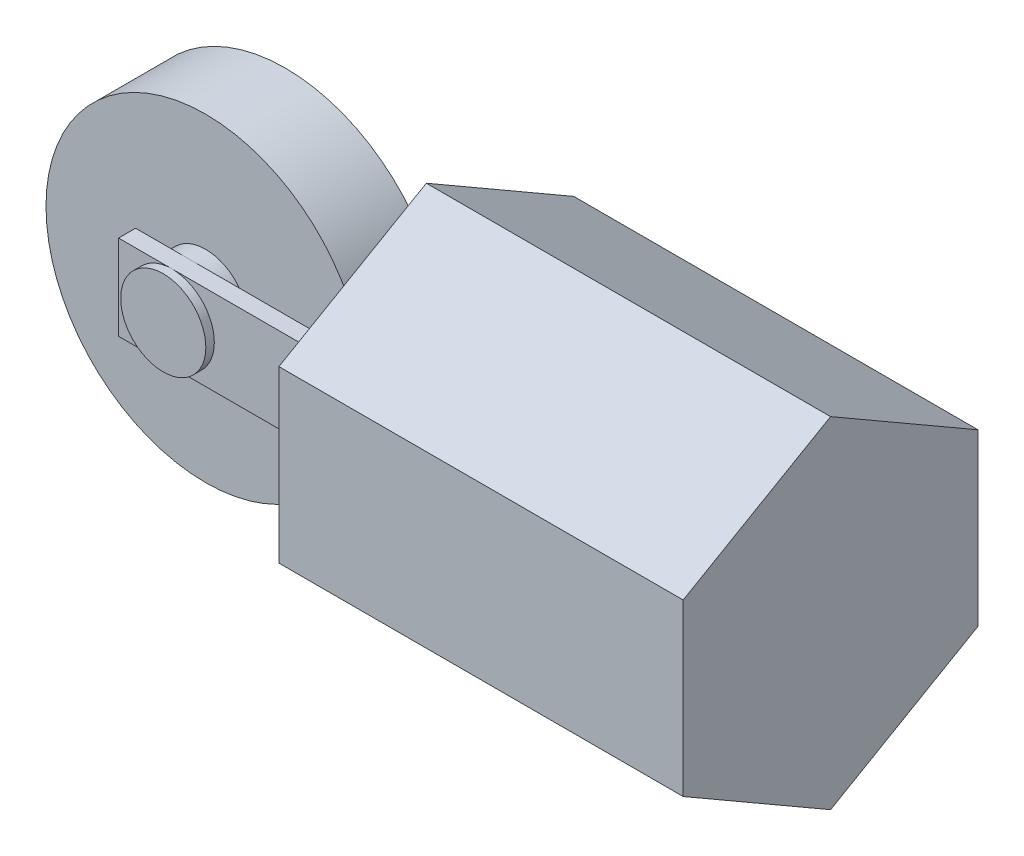
ISO-10303-21;
HEADER;
FILE_DESCRIPTION(('STEP AP214'),'2;1');
FILE_NAME('part.step','',(''),(''),'','','');
FILE_SCHEMA(('AUTOMOTIVE_DESIGN { 1 0 10303 214 1 1 1 1 }'));
ENDSEC;
DATA;
#1=APPLICATION_CONTEXT('core data for automotive mechanical design processes');
#2=APPLICATION_PROTOCOL_DEFINITION('international standard','automotive_design',2000,#1);
#3=PRODUCT_CONTEXT('',#1,'mechanical');
#4=PRODUCT('Part','Part','',(#3));
#5=PRODUCT_RELATED_PRODUCT_CATEGORY('part','',(#4));
#6=PRODUCT_DEFINITION_FORMATION('','',#4);
#7=PRODUCT_DEFINITION_CONTEXT('part definition',#1,'design');
#8=PRODUCT_DEFINITION('design','',#6,#7);
#9=PRODUCT_DEFINITION_SHAPE('','',#8);
#10=(LENGTH_UNIT() NAMED_UNIT(*) SI_UNIT(.MILLI.,.METRE.));
#11=(NAMED_UNIT(*) PLANE_ANGLE_UNIT() SI_UNIT($,.RADIAN.));
#12=(NAMED_UNIT(*) SI_UNIT($,.STERADIAN.) SOLID_ANGLE_UNIT());
#13=UNCERTAINTY_MEASURE_WITH_UNIT(LENGTH_MEASURE(1.E-05),#10,'distance_accuracy_value','');
#14=(GEOMETRIC_REPRESENTATION_CONTEXT(3) GLOBAL_UNCERTAINTY_ASSIGNED_CONTEXT((#13)) GLOBAL_UNIT_ASSIGNED_CONTEXT((#10,
#11,#12)) REPRESENTATION_CONTEXT('',''));
#15=CARTESIAN_POINT('',(0.,0.,0.));
#16=DIRECTION('',(0.,0.,1.));
#17=DIRECTION('',(1.,0.,0.));
#18=AXIS2_PLACEMENT_3D('',#15,#16,#17);
#19=CARTESIAN_POINT('',(34.925,-2.53999999999996,-4.39940905122497));
#20=DIRECTION('',(0.,0.,1.));
#21=DIRECTION('',(0.,-1.,0.));
#22=AXIS2_PLACEMENT_3D('',#19,#20,#21);
#23=PLANE('',#22);
#24=DIRECTION('',(0.,1.,0.));
#25=VECTOR('',#24,1.);
#26=CARTESIAN_POINT('',(10.795,-2.53999999999996,-4.39940905122497));
#27=LINE('',#26,#25);
#28=CARTESIAN_POINT('',(10.795,-2.53999999999996,-4.39940905122497));
#29=VERTEX_POINT('',#28);
#30=CARTESIAN_POINT('',(10.795,2.54000000000004,-4.39940905122493));
#31=VERTEX_POINT('',#30);
#32=EDGE_CURVE('E2204',#29,#31,#27,.T.);
#33=ORIENTED_EDGE('',*,*,#32,.F.);
#34=DIRECTION('',(1.,0.,0.));
#35=VECTOR('',#34,1.);
#36=CARTESIAN_POINT('',(-3.175,-2.53999999999996,-4.39940905122497));
#37=LINE('',#36,#35);
#38=CARTESIAN_POINT('',(0.,-2.53999999999996,-4.39940905122497));
#39=VERTEX_POINT('',#38);
#40=EDGE_CURVE('E2270',#39,#29,#37,.T.);
#41=ORIENTED_EDGE('',*,*,#40,.F.);
#42=CARTESIAN_POINT('',(0.,0.,-4.39940905122495));
#43=DIRECTION('',(0.,0.,1.));
#44=DIRECTION('',(0.,-1.,0.));
#45=AXIS2_PLACEMENT_3D('',#42,#43,#44);
#46=CIRCLE('',#45,2.53999999999996);
#47=CARTESIAN_POINT('',(0.,2.54000000000004,-4.39940905122493));
#48=VERTEX_POINT('',#47);
#49=EDGE_CURVE('E1997',#48,#39,#46,.F.);
#50=ORIENTED_EDGE('',*,*,#49,.F.);
#51=DIRECTION('',(1.,0.,0.));
#52=VECTOR('',#51,1.);
#53=CARTESIAN_POINT('',(-3.175,2.54000000000004,-4.39940905122493));
#54=LINE('',#53,#52);
#55=EDGE_CURVE('E2233',#48,#31,#54,.T.);
#56=ORIENTED_EDGE('',*,*,#55,.T.);
#57=EDGE_LOOP('',(#33,#41,#50,#56));
#58=FACE_BOUND('',#57,.T.);
#59=ADVANCED_FACE('F1994',(#58),#23,.F.);
#60=CARTESIAN_POINT('',(34.925,2.53999999999996,4.39940905122497));
#61=DIRECTION('',(0.,0.,-1.));
#62=DIRECTION('',(0.,1.,0.));
#63=AXIS2_PLACEMENT_3D('',#60,#61,#62);
#64=PLANE('',#63);
#65=DIRECTION('',(0.,-1.,0.));
#66=VECTOR('',#65,1.);
#67=CARTESIAN_POINT('',(10.795,2.53999999999996,4.39940905122497));
#68=LINE('',#67,#66);
#69=CARTESIAN_POINT('',(10.795,2.53999999999996,4.39940905122497));
#70=VERTEX_POINT('',#69);
#71=CARTESIAN_POINT('',(10.795,-2.54000000000004,4.39940905122493));
#72=VERTEX_POINT('',#71);
#73=EDGE_CURVE('E2188',#70,#72,#68,.T.);
#74=ORIENTED_EDGE('',*,*,#73,.F.);
#75=DIRECTION('',(1.,0.,0.));
#76=VECTOR('',#75,1.);
#77=CARTESIAN_POINT('',(-3.175,2.53999999999996,4.39940905122497));
#78=LINE('',#77,#76);
#79=CARTESIAN_POINT('',(0.,2.53999999999996,4.39940905122497));
#80=VERTEX_POINT('',#79);
#81=EDGE_CURVE('E2246',#80,#70,#78,.T.);
#82=ORIENTED_EDGE('',*,*,#81,.F.);
#83=CARTESIAN_POINT('',(0.,0.,4.39940905122495));
#84=DIRECTION('',(0.,0.,-1.));
#85=DIRECTION('',(0.,1.,0.));
#86=AXIS2_PLACEMENT_3D('',#83,#84,#85);
#87=CIRCLE('',#86,2.53999999999996);
#88=CARTESIAN_POINT('',(0.,-2.54000000000004,4.39940905122493));
#89=VERTEX_POINT('',#88);
#90=EDGE_CURVE('E2319',#89,#80,#87,.F.);
#91=ORIENTED_EDGE('',*,*,#90,.F.);
#92=DIRECTION('',(1.,0.,0.));
#93=VECTOR('',#92,1.);
#94=CARTESIAN_POINT('',(-3.175,-2.54000000000004,4.39940905122493));
#95=LINE('',#94,#93);
#96=EDGE_CURVE('E2249',#89,#72,#95,.T.);
#97=ORIENTED_EDGE('',*,*,#96,.T.);
#98=EDGE_LOOP('',(#74,#82,#91,#97));
#99=FACE_BOUND('',#98,.T.);
#100=ADVANCED_FACE('F2520',(#99),#64,.F.);
#101=CARTESIAN_POINT('',(0.,0.,-4.99859094877504));
#102=DIRECTION('',(0.,0.,1.));
#103=DIRECTION('',(1.,0.,0.));
#104=AXIS2_PLACEMENT_3D('',#101,#102,#103);
#105=CYLINDRICAL_SURFACE('',#104,2.53999999999996);
#106=CARTESIAN_POINT('',(0.,0.,-2.38125));
#107=DIRECTION('',(0.,0.,1.));
#108=DIRECTION('',(1.,0.,0.));
#109=AXIS2_PLACEMENT_3D('',#106,#107,#108);
#110=CIRCLE('',#109,2.53999999999996);
#111=CARTESIAN_POINT('',(2.53999999999996,0.,-2.38125));
#112=VERTEX_POINT('',#111);
#113=EDGE_CURVE('E2297',#112,#112,#110,.T.);
#114=ORIENTED_EDGE('',*,*,#113,.F.);
#115=EDGE_LOOP('',(#114));
#116=FACE_BOUND('',#115,.T.);
#117=CARTESIAN_POINT('',(0.,0.,-3.38340905122497));
#118=DIRECTION('',(0.,0.,-1.));
#119=DIRECTION('',(-1.,0.,0.));
#120=AXIS2_PLACEMENT_3D('',#117,#118,#119);
#121=CIRCLE('',#120,2.53999999999996);
#122=CARTESIAN_POINT('',(0.,2.54000000000004,-3.38340905122497));
#123=VERTEX_POINT('',#122);
#124=CARTESIAN_POINT('',(0.,-2.53999999999996,-3.38340905122497));
#125=VERTEX_POINT('',#124);
#126=EDGE_CURVE('E2325',#123,#125,#121,.F.);
#127=ORIENTED_EDGE('',*,*,#126,.T.);
#128=EDGE_CURVE('E2330',#125,#123,#121,.F.);
#129=ORIENTED_EDGE('',*,*,#128,.T.);
#130=EDGE_LOOP('',(#127,#129));
#131=FACE_BOUND('',#130,.T.);
#132=ADVANCED_FACE('F2517',(#116,#131),#105,.T.);
#133=CARTESIAN_POINT('',(0.,0.,2.38125));
#134=DIRECTION('',(0.,0.,1.));
#135=DIRECTION('',(1.,0.,0.));
#136=AXIS2_PLACEMENT_3D('',#133,#134,#135);
#137=CIRCLE('',#136,2.53999999999996);
#138=CARTESIAN_POINT('',(2.53999999999996,0.,2.38125));
#139=VERTEX_POINT('',#138);
#140=EDGE_CURVE('E2299',#139,#139,#137,.T.);
#141=ORIENTED_EDGE('',*,*,#140,.T.);
#142=EDGE_LOOP('',(#141));
#143=FACE_BOUND('',#142,.T.);
#144=CARTESIAN_POINT('',(0.,0.,3.38340905122497));
#145=DIRECTION('',(0.,0.,1.));
#146=DIRECTION('',(1.,0.,0.));
#147=AXIS2_PLACEMENT_3D('',#144,#145,#146);
#148=CIRCLE('',#147,2.53999999999996);
#149=CARTESIAN_POINT('',(0.,2.53999999999996,3.38340905122497));
#150=VERTEX_POINT('',#149);
#151=CARTESIAN_POINT('',(0.,-2.54,3.38340905122497));
#152=VERTEX_POINT('',#151);
#153=EDGE_CURVE('E2302',#150,#152,#148,.F.);
#154=ORIENTED_EDGE('',*,*,#153,.T.);
#155=EDGE_CURVE('E2318',#152,#150,#148,.F.);
#156=ORIENTED_EDGE('',*,*,#155,.T.);
#157=EDGE_LOOP('',(#154,#156));
#158=FACE_BOUND('',#157,.T.);
#159=ADVANCED_FACE('F2526',(#143,#158),#105,.T.);
#160=CARTESIAN_POINT('',(0.,0.,2.38125));
#161=DIRECTION('',(0.,0.,-1.));
#162=DIRECTION('',(-1.,0.,0.));
#163=AXIS2_PLACEMENT_3D('',#160,#161,#162);
#164=CYLINDRICAL_SURFACE('',#163,9.525);
#165=CARTESIAN_POINT('',(0.,0.,-2.38125));
#166=DIRECTION('',(0.,0.,1.));
#167=DIRECTION('',(1.,0.,0.));
#168=AXIS2_PLACEMENT_3D('',#165,#166,#167);
#169=CIRCLE('',#168,9.525);
#170=CARTESIAN_POINT('',(-9.525,0.,-2.38125));
#171=VERTEX_POINT('',#170);
#172=EDGE_CURVE('E2308',#171,#171,#169,.T.);
#173=CARTESIAN_POINT('',(0.,0.,2.38125));
#174=DIRECTION('',(0.,0.,1.));
#175=DIRECTION('',(1.,0.,0.));
#176=AXIS2_PLACEMENT_3D('',#173,#174,#175);
#177=CIRCLE('',#176,9.525);
#178=CARTESIAN_POINT('',(-9.525,0.,2.38125));
#179=VERTEX_POINT('',#178);
#180=EDGE_CURVE('E2304',#179,#179,#177,.T.);
#181=CARTESIAN_POINT('',(-9.525,0.,-2.38125));
#182=CARTESIAN_POINT('',(-9.525,0.,-2.331640625));
#183=CARTESIAN_POINT('',(-9.525,0.,-2.28203125));
#184=CARTESIAN_POINT('',(-9.525,0.,-2.1828125));
#185=CARTESIAN_POINT('',(-9.525,0.,-2.133203125));
#186=CARTESIAN_POINT('',(-9.525,0.,-2.033984375));
#187=CARTESIAN_POINT('',(-9.525,0.,-1.984375));
#188=CARTESIAN_POINT('',(-9.525,0.,-1.88515625));
#189=CARTESIAN_POINT('',(-9.525,0.,-1.835546875));
#190=CARTESIAN_POINT('',(-9.525,0.,-1.736328125));
#191=CARTESIAN_POINT('',(-9.525,0.,-1.68671875));
#192=CARTESIAN_POINT('',(-9.525,0.,-1.5875));
#193=CARTESIAN_POINT('',(-9.525,0.,-1.537890625));
#194=CARTESIAN_POINT('',(-9.525,0.,-1.438671875));
#195=CARTESIAN_POINT('',(-9.525,0.,-1.3890625));
#196=CARTESIAN_POINT('',(-9.525,0.,-1.28984375));
#197=CARTESIAN_POINT('',(-9.525,0.,-1.240234375));
#198=CARTESIAN_POINT('',(-9.525,0.,-1.141015625));
#199=CARTESIAN_POINT('',(-9.525,0.,-1.09140625));
#200=CARTESIAN_POINT('',(-9.525,0.,-0.9921875));
#201=CARTESIAN_POINT('',(-9.525,0.,-0.942578125));
#202=CARTESIAN_POINT('',(-9.525,0.,-0.843359375));
#203=CARTESIAN_POINT('',(-9.525,0.,-0.79375));
#204=CARTESIAN_POINT('',(-9.525,0.,-0.69453125));
#205=CARTESIAN_POINT('',(-9.525,0.,-0.644921875));
#206=CARTESIAN_POINT('',(-9.525,0.,-0.545703125));
#207=CARTESIAN_POINT('',(-9.525,0.,-0.49609375));
#208=CARTESIAN_POINT('',(-9.525,0.,-0.396875));
#209=CARTESIAN_POINT('',(-9.525,0.,-0.347265625));
#210=CARTESIAN_POINT('',(-9.525,0.,-0.248046875));
#211=CARTESIAN_POINT('',(-9.525,0.,-0.1984375));
#212=CARTESIAN_POINT('',(-9.525,0.,-0.09921875));
#213=CARTESIAN_POINT('',(-9.525,0.,-0.049609375));
#214=CARTESIAN_POINT('',(-9.525,0.,0.049609375));
#215=CARTESIAN_POINT('',(-9.525,0.,0.09921875));
#216=CARTESIAN_POINT('',(-9.525,0.,0.1984375));
#217=CARTESIAN_POINT('',(-9.525,0.,0.248046875));
#218=CARTESIAN_POINT('',(-9.525,0.,0.347265625));
#219=CARTESIAN_POINT('',(-9.525,0.,0.396875));
#220=CARTESIAN_POINT('',(-9.525,0.,0.49609375));
#221=CARTESIAN_POINT('',(-9.525,0.,0.545703125));
#222=CARTESIAN_POINT('',(-9.525,0.,0.644921875));
#223=CARTESIAN_POINT('',(-9.525,0.,0.69453125));
#224=CARTESIAN_POINT('',(-9.525,0.,0.79375));
#225=CARTESIAN_POINT('',(-9.525,0.,0.843359375));
#226=CARTESIAN_POINT('',(-9.525,0.,0.942578125));
#227=CARTESIAN_POINT('',(-9.525,0.,0.9921875));
#228=CARTESIAN_POINT('',(-9.525,0.,1.09140625));
#229=CARTESIAN_POINT('',(-9.525,0.,1.141015625));
#230=CARTESIAN_POINT('',(-9.525,0.,1.240234375));
#231=CARTESIAN_POINT('',(-9.525,0.,1.28984375));
#232=CARTESIAN_POINT('',(-9.525,0.,1.3890625));
#233=CARTESIAN_POINT('',(-9.525,0.,1.438671875));
#234=CARTESIAN_POINT('',(-9.525,0.,1.537890625));
#235=CARTESIAN_POINT('',(-9.525,0.,1.5875));
#236=CARTESIAN_POINT('',(-9.525,0.,1.68671875));
#237=CARTESIAN_POINT('',(-9.525,0.,1.736328125));
#238=CARTESIAN_POINT('',(-9.525,0.,1.835546875));
#239=CARTESIAN_POINT('',(-9.525,0.,1.88515625));
#240=CARTESIAN_POINT('',(-9.525,0.,1.984375));
#241=CARTESIAN_POINT('',(-9.525,0.,2.033984375));
#242=CARTESIAN_POINT('',(-9.525,0.,2.133203125));
#243=CARTESIAN_POINT('',(-9.525,0.,2.1828125));
#244=CARTESIAN_POINT('',(-9.525,0.,2.28203125));
#245=CARTESIAN_POINT('',(-9.525,0.,2.331640625));
#246=CARTESIAN_POINT('',(-9.525,0.,2.38125));
#247=B_SPLINE_CURVE_WITH_KNOTS('',3,(#181,#182,#183,#184,#185,#186,#187,#188,#189,#190,#191,
#192,#193,#194,#195,#196,#197,#198,#199,#200,#201,#202,#203,#204,#205,#206,#207,#208,#209,#210,
#211,#212,#213,#214,#215,#216,#217,#218,#219,#220,#221,#222,#223,#224,#225,#226,#227,#228,#229,
#230,#231,#232,#233,#234,#235,#236,#237,#238,#239,#240,#241,#242,#243,#244,#245,#246),
.UNSPECIFIED.,.F.,.F.,(4,2,2,2,2,2,2,2,2,2,2,2,2,2,2,2,2,2,2,2,2,2,2,2,2,2,2,2,2,2,2,2,4),(0.,
0.148828125,0.29765625,0.446484375,0.5953125,0.744140625,0.89296875,1.041796875,1.190625,
1.339453125,1.48828125,1.637109375,1.7859375,1.934765625,2.08359375,2.232421875,2.38125,
2.530078125,2.67890625,2.827734375,2.9765625,3.125390625,3.27421875,3.423046875,3.571875,
3.720703125,3.86953125,4.018359375,4.1671875,4.316015625,4.46484375,4.613671875,4.7625),.UNSPECIFIED.);
#248=EDGE_CURVE('BSEAM1995',#171,#179,#247,.T.);
#249=ORIENTED_EDGE('',*,*,#172,.T.);
#250=ORIENTED_EDGE('',*,*,#180,.F.);
#251=ORIENTED_EDGE('',*,*,#248,.T.);
#252=ORIENTED_EDGE('',*,*,#248,.F.);
#253=EDGE_LOOP('',(#249,#251,#250,#252));
#254=FACE_BOUND('',#253,.T.);
#255=ADVANCED_FACE('F1995',(#254),#164,.T.);
#256=CARTESIAN_POINT('',(0.,0.,2.38125));
#257=DIRECTION('',(0.,0.,1.));
#258=DIRECTION('',(1.,0.,0.));
#259=AXIS2_PLACEMENT_3D('',#256,#257,#258);
#260=PLANE('',#259);
#261=ORIENTED_EDGE('',*,*,#140,.F.);
#262=EDGE_LOOP('',(#261));
#263=FACE_BOUND('',#262,.T.);
#264=ORIENTED_EDGE('',*,*,#180,.T.);
#265=EDGE_LOOP('',(#264));
#266=FACE_BOUND('',#265,.T.);
#267=ADVANCED_FACE('F2572',(#263,#266),#260,.T.);
#268=CARTESIAN_POINT('',(0.,0.,-2.38125));
#269=DIRECTION('',(0.,0.,1.));
#270=DIRECTION('',(1.,0.,0.));
#271=AXIS2_PLACEMENT_3D('',#268,#269,#270);
#272=PLANE('',#271);
#273=ORIENTED_EDGE('',*,*,#113,.T.);
#274=EDGE_LOOP('',(#273));
#275=FACE_BOUND('',#274,.T.);
#276=ORIENTED_EDGE('',*,*,#172,.F.);
#277=EDGE_LOOP('',(#276));
#278=FACE_BOUND('',#277,.T.);
#279=ADVANCED_FACE('F2567',(#275,#278),#272,.F.);
#280=EDGE_CURVE('E12',#39,#48,#46,.F.);
#281=ORIENTED_EDGE('',*,*,#280,.F.);
#282=CARTESIAN_POINT('',(-3.175,-2.53999999999996,-4.39940905122497));
#283=VERTEX_POINT('',#282);
#284=EDGE_CURVE('E2007',#283,#39,#37,.T.);
#285=ORIENTED_EDGE('',*,*,#284,.F.);
#286=DIRECTION('',(0.,-1.,0.));
#287=VECTOR('',#286,1.);
#288=CARTESIAN_POINT('',(-3.175,2.54000000000004,-4.39940905122493));
#289=LINE('',#288,#287);
#290=CARTESIAN_POINT('',(-3.175,2.54000000000004,-4.39940905122493));
#291=VERTEX_POINT('',#290);
#292=EDGE_CURVE('E2288',#291,#283,#289,.T.);
#293=ORIENTED_EDGE('',*,*,#292,.F.);
#294=EDGE_CURVE('E2264',#291,#48,#54,.T.);
#295=ORIENTED_EDGE('',*,*,#294,.T.);
#296=EDGE_LOOP('',(#281,#285,#293,#295));
#297=FACE_BOUND('',#296,.T.);
#298=ADVANCED_FACE('F2463',(#297),#23,.F.);
#299=CARTESIAN_POINT('',(-3.175,2.54000000000004,-4.39940905122493));
#300=DIRECTION('',(0.,-1.,0.));
#301=DIRECTION('',(0.,0.,-1.));
#302=AXIS2_PLACEMENT_3D('',#299,#300,#301);
#303=PLANE('',#302);
#304=DIRECTION('',(1.,0.,0.));
#305=VECTOR('',#304,1.);
#306=CARTESIAN_POINT('',(-3.175,2.54000000000004,-3.38340905122497));
#307=LINE('',#306,#305);
#308=CARTESIAN_POINT('',(-3.175,2.54000000000004,-3.38340905122497));
#309=VERTEX_POINT('',#308);
#310=EDGE_CURVE('E2276',#309,#123,#307,.T.);
#311=ORIENTED_EDGE('',*,*,#310,.T.);
#312=CARTESIAN_POINT('',(10.795,2.54000000000004,-3.38340905122497));
#313=VERTEX_POINT('',#312);
#314=EDGE_CURVE('E2273',#123,#313,#307,.T.);
#315=ORIENTED_EDGE('',*,*,#314,.T.);
#316=DIRECTION('',(0.,0.,1.));
#317=VECTOR('',#316,1.);
#318=CARTESIAN_POINT('',(10.795,2.54000000000004,-4.39940905122493));
#319=LINE('',#318,#317);
#320=EDGE_CURVE('E2213',#31,#313,#319,.T.);
#321=ORIENTED_EDGE('',*,*,#320,.F.);
#322=ORIENTED_EDGE('',*,*,#55,.F.);
#323=ORIENTED_EDGE('',*,*,#294,.F.);
#324=DIRECTION('',(0.,0.,-1.));
#325=VECTOR('',#324,1.);
#326=CARTESIAN_POINT('',(-3.175,2.54000000000004,-4.39940905122493));
#327=LINE('',#326,#325);
#328=EDGE_CURVE('E2240',#309,#291,#327,.T.);
#329=ORIENTED_EDGE('',*,*,#328,.F.);
#330=EDGE_LOOP('',(#311,#315,#321,#322,#323,#329));
#331=FACE_BOUND('',#330,.T.);
#332=ADVANCED_FACE('F2455',(#331),#303,.F.);
#333=CARTESIAN_POINT('',(-3.175,-2.53999999999996,-4.39940905122497));
#334=DIRECTION('',(0.,1.,0.));
#335=DIRECTION('',(0.,0.,1.));
#336=AXIS2_PLACEMENT_3D('',#333,#334,#335);
#337=PLANE('',#336);
#338=DIRECTION('',(1.,0.,0.));
#339=VECTOR('',#338,1.);
#340=CARTESIAN_POINT('',(-3.175,-2.53999999999996,-3.38340905122497));
#341=LINE('',#340,#339);
#342=CARTESIAN_POINT('',(10.795,-2.53999999999996,-3.38340905122497));
#343=VERTEX_POINT('',#342);
#344=EDGE_CURVE('E2275',#125,#343,#341,.T.);
#345=ORIENTED_EDGE('',*,*,#344,.F.);
#346=CARTESIAN_POINT('',(-3.175,-2.53999999999996,-3.38340905122497));
#347=VERTEX_POINT('',#346);
#348=EDGE_CURVE('E2018',#347,#125,#341,.T.);
#349=ORIENTED_EDGE('',*,*,#348,.F.);
#350=DIRECTION('',(0.,0.,1.));
#351=VECTOR('',#350,1.);
#352=CARTESIAN_POINT('',(-3.175,-2.53999999999996,-4.39940905122497));
#353=LINE('',#352,#351);
#354=EDGE_CURVE('E2282',#283,#347,#353,.T.);
#355=ORIENTED_EDGE('',*,*,#354,.F.);
#356=ORIENTED_EDGE('',*,*,#284,.T.);
#357=ORIENTED_EDGE('',*,*,#40,.T.);
#358=DIRECTION('',(0.,0.,-1.));
#359=VECTOR('',#358,1.);
#360=CARTESIAN_POINT('',(10.795,-2.53999999999996,-3.38340905122497));
#361=LINE('',#360,#359);
#362=EDGE_CURVE('E2219',#343,#29,#361,.T.);
#363=ORIENTED_EDGE('',*,*,#362,.F.);
#364=EDGE_LOOP('',(#345,#349,#355,#356,#357,#363));
#365=FACE_BOUND('',#364,.T.);
#366=ADVANCED_FACE('F2459',(#365),#337,.F.);
#367=CARTESIAN_POINT('',(-3.175,2.54000000000004,-3.38340905122497));
#368=DIRECTION('',(0.,0.,-1.));
#369=DIRECTION('',(-1.,0.,0.));
#370=AXIS2_PLACEMENT_3D('',#367,#368,#369);
#371=PLANE('',#370);
#372=ORIENTED_EDGE('',*,*,#128,.F.);
#373=ORIENTED_EDGE('',*,*,#344,.T.);
#374=DIRECTION('',(0.,-1.,0.));
#375=VECTOR('',#374,1.);
#376=CARTESIAN_POINT('',(10.795,2.54000000000004,-3.38340905122497));
#377=LINE('',#376,#375);
#378=EDGE_CURVE('E2211',#313,#343,#377,.T.);
#379=ORIENTED_EDGE('',*,*,#378,.F.);
#380=ORIENTED_EDGE('',*,*,#314,.F.);
#381=EDGE_LOOP('',(#372,#373,#379,#380));
#382=FACE_BOUND('',#381,.T.);
#383=ADVANCED_FACE('F2535',(#382),#371,.F.);
#384=EDGE_CURVE('E2322',#80,#89,#87,.F.);
#385=ORIENTED_EDGE('',*,*,#384,.F.);
#386=CARTESIAN_POINT('',(-3.175,2.53999999999996,4.39940905122497));
#387=VERTEX_POINT('',#386);
#388=EDGE_CURVE('E2250',#387,#80,#78,.T.);
#389=ORIENTED_EDGE('',*,*,#388,.F.);
#390=DIRECTION('',(0.,1.,0.));
#391=VECTOR('',#390,1.);
#392=CARTESIAN_POINT('',(-3.175,2.53999999999996,4.39940905122497));
#393=LINE('',#392,#391);
#394=CARTESIAN_POINT('',(-3.175,-2.54000000000004,4.39940905122493));
#395=VERTEX_POINT('',#394);
#396=EDGE_CURVE('E2243',#395,#387,#393,.T.);
#397=ORIENTED_EDGE('',*,*,#396,.F.);
#398=EDGE_CURVE('E2251',#395,#89,#95,.T.);
#399=ORIENTED_EDGE('',*,*,#398,.T.);
#400=EDGE_LOOP('',(#385,#389,#397,#399));
#401=FACE_BOUND('',#400,.T.);
#402=ADVANCED_FACE('F2336',(#401),#64,.F.);
#403=CARTESIAN_POINT('',(-3.175,2.53999999999996,4.39940905122497));
#404=DIRECTION('',(0.,-1.,0.));
#405=DIRECTION('',(0.,0.,-1.));
#406=AXIS2_PLACEMENT_3D('',#403,#404,#405);
#407=PLANE('',#406);
#408=ORIENTED_EDGE('',*,*,#388,.T.);
#409=ORIENTED_EDGE('',*,*,#81,.T.);
#410=DIRECTION('',(0.,0.,1.));
#411=VECTOR('',#410,1.);
#412=CARTESIAN_POINT('',(10.795,2.53999999999996,3.38340905122497));
#413=LINE('',#412,#411);
#414=CARTESIAN_POINT('',(10.795,2.53999999999996,3.38340905122497));
#415=VERTEX_POINT('',#414);
#416=EDGE_CURVE('E2210',#415,#70,#413,.T.);
#417=ORIENTED_EDGE('',*,*,#416,.F.);
#418=DIRECTION('',(1.,0.,0.));
#419=VECTOR('',#418,1.);
#420=CARTESIAN_POINT('',(-3.175,2.53999999999996,3.38340905122497));
#421=LINE('',#420,#419);
#422=EDGE_CURVE('E2256',#150,#415,#421,.T.);
#423=ORIENTED_EDGE('',*,*,#422,.F.);
#424=CARTESIAN_POINT('',(-3.175,2.53999999999996,3.38340905122497));
#425=VERTEX_POINT('',#424);
#426=EDGE_CURVE('E2258',#425,#150,#421,.T.);
#427=ORIENTED_EDGE('',*,*,#426,.F.);
#428=DIRECTION('',(0.,0.,-1.));
#429=VECTOR('',#428,1.);
#430=CARTESIAN_POINT('',(-3.175,2.53999999999996,4.39940905122497));
#431=LINE('',#430,#429);
#432=EDGE_CURVE('E2232',#387,#425,#431,.T.);
#433=ORIENTED_EDGE('',*,*,#432,.F.);
#434=EDGE_LOOP('',(#408,#409,#417,#423,#427,#433));
#435=FACE_BOUND('',#434,.T.);
#436=ADVANCED_FACE('F2512',(#435),#407,.F.);
#437=CARTESIAN_POINT('',(-3.175,2.53999999999996,3.38340905122497));
#438=DIRECTION('',(0.,0.,1.));
#439=DIRECTION('',(1.,0.,0.));
#440=AXIS2_PLACEMENT_3D('',#437,#438,#439);
#441=PLANE('',#440);
#442=ORIENTED_EDGE('',*,*,#155,.F.);
#443=DIRECTION('',(1.,0.,0.));
#444=VECTOR('',#443,1.);
#445=CARTESIAN_POINT('',(-3.175,-2.54000000000004,3.38340905122497));
#446=LINE('',#445,#444);
#447=CARTESIAN_POINT('',(-3.175,-2.54000000000004,3.38340905122497));
#448=VERTEX_POINT('',#447);
#449=EDGE_CURVE('E2257',#448,#152,#446,.T.);
#450=ORIENTED_EDGE('',*,*,#449,.F.);
#451=DIRECTION('',(0.,-1.,0.));
#452=VECTOR('',#451,1.);
#453=CARTESIAN_POINT('',(-3.175,2.53999999999996,3.38340905122497));
#454=LINE('',#453,#452);
#455=EDGE_CURVE('E2238',#425,#448,#454,.T.);
#456=ORIENTED_EDGE('',*,*,#455,.F.);
#457=ORIENTED_EDGE('',*,*,#426,.T.);
#458=EDGE_LOOP('',(#442,#450,#456,#457));
#459=FACE_BOUND('',#458,.T.);
#460=ADVANCED_FACE('F2537',(#459),#441,.F.);
#461=CARTESIAN_POINT('',(-3.175,-2.54000000000004,4.39940905122493));
#462=DIRECTION('',(0.,1.,0.));
#463=DIRECTION('',(0.,0.,1.));
#464=AXIS2_PLACEMENT_3D('',#461,#462,#463);
#465=PLANE('',#464);
#466=ORIENTED_EDGE('',*,*,#96,.F.);
#467=ORIENTED_EDGE('',*,*,#398,.F.);
#468=DIRECTION('',(0.,0.,1.));
#469=VECTOR('',#468,1.);
#470=CARTESIAN_POINT('',(-3.175,-2.54000000000004,4.39940905122493));
#471=LINE('',#470,#469);
#472=EDGE_CURVE('E2237',#448,#395,#471,.T.);
#473=ORIENTED_EDGE('',*,*,#472,.F.);
#474=ORIENTED_EDGE('',*,*,#449,.T.);
#475=CARTESIAN_POINT('',(10.795,-2.54000000000004,3.38340905122497));
#476=VERTEX_POINT('',#475);
#477=EDGE_CURVE('E2254',#152,#476,#446,.T.);
#478=ORIENTED_EDGE('',*,*,#477,.T.);
#479=DIRECTION('',(0.,0.,-1.));
#480=VECTOR('',#479,1.);
#481=CARTESIAN_POINT('',(10.795,-2.54000000000004,4.39940905122493));
#482=LINE('',#481,#480);
#483=EDGE_CURVE('E2222',#72,#476,#482,.T.);
#484=ORIENTED_EDGE('',*,*,#483,.F.);
#485=EDGE_LOOP('',(#466,#467,#473,#474,#478,#484));
#486=FACE_BOUND('',#485,.T.);
#487=ADVANCED_FACE('F2350',(#486),#465,.F.);
#488=ORIENTED_EDGE('',*,*,#126,.F.);
#489=ORIENTED_EDGE('',*,*,#310,.F.);
#490=DIRECTION('',(0.,1.,0.));
#491=VECTOR('',#490,1.);
#492=CARTESIAN_POINT('',(-3.175,2.54000000000004,-3.38340905122497));
#493=LINE('',#492,#491);
#494=EDGE_CURVE('E2279',#347,#309,#493,.T.);
#495=ORIENTED_EDGE('',*,*,#494,.F.);
#496=ORIENTED_EDGE('',*,*,#348,.T.);
#497=EDGE_LOOP('',(#488,#489,#495,#496));
#498=FACE_BOUND('',#497,.T.);
#499=ADVANCED_FACE('F2544',(#498),#371,.F.);
#500=CARTESIAN_POINT('',(-3.175,0.,0.));
#501=DIRECTION('',(1.,0.,0.));
#502=DIRECTION('',(0.,0.,-1.));
#503=AXIS2_PLACEMENT_3D('',#500,#501,#502);
#504=PLANE('',#503);
#505=ORIENTED_EDGE('',*,*,#328,.T.);
#506=ORIENTED_EDGE('',*,*,#292,.T.);
#507=ORIENTED_EDGE('',*,*,#354,.T.);
#508=ORIENTED_EDGE('',*,*,#494,.T.);
#509=EDGE_LOOP('',(#505,#506,#507,#508));
#510=FACE_BOUND('',#509,.T.);
#511=ADVANCED_FACE('F2548',(#510),#504,.F.);
#512=ORIENTED_EDGE('',*,*,#153,.F.);
#513=ORIENTED_EDGE('',*,*,#422,.T.);
#514=DIRECTION('',(0.,1.,0.));
#515=VECTOR('',#514,1.);
#516=CARTESIAN_POINT('',(10.795,-2.54000000000004,3.38340905122497));
#517=LINE('',#516,#515);
#518=EDGE_CURVE('E2229',#476,#415,#517,.T.);
#519=ORIENTED_EDGE('',*,*,#518,.F.);
#520=ORIENTED_EDGE('',*,*,#477,.F.);
#521=EDGE_LOOP('',(#512,#513,#519,#520));
#522=FACE_BOUND('',#521,.T.);
#523=ADVANCED_FACE('F2509',(#522),#441,.F.);
#524=CARTESIAN_POINT('',(-3.175,0.,0.));
#525=DIRECTION('',(-1.,0.,0.));
#526=DIRECTION('',(0.,0.,1.));
#527=AXIS2_PLACEMENT_3D('',#524,#525,#526);
#528=PLANE('',#527);
#529=ORIENTED_EDGE('',*,*,#432,.T.);
#530=ORIENTED_EDGE('',*,*,#455,.T.);
#531=ORIENTED_EDGE('',*,*,#472,.T.);
#532=ORIENTED_EDGE('',*,*,#396,.T.);
#533=EDGE_LOOP('',(#529,#530,#531,#532));
#534=FACE_BOUND('',#533,.T.);
#535=ADVANCED_FACE('F2565',(#534),#528,.T.);
#536=CARTESIAN_POINT('',(10.795,0.,0.));
#537=DIRECTION('',(1.,0.,0.));
#538=DIRECTION('',(0.,0.,-1.));
#539=AXIS2_PLACEMENT_3D('',#536,#537,#538);
#540=PLANE('',#539);
#541=ORIENTED_EDGE('',*,*,#73,.T.);
#542=ORIENTED_EDGE('',*,*,#483,.T.);
#543=ORIENTED_EDGE('',*,*,#518,.T.);
#544=ORIENTED_EDGE('',*,*,#416,.T.);
#545=EDGE_LOOP('',(#541,#542,#543,#544));
#546=FACE_BOUND('',#545,.T.);
#547=ORIENTED_EDGE('',*,*,#32,.T.);
#548=ORIENTED_EDGE('',*,*,#320,.T.);
#549=ORIENTED_EDGE('',*,*,#378,.T.);
#550=ORIENTED_EDGE('',*,*,#362,.T.);
#551=EDGE_LOOP('',(#547,#548,#549,#550));
#552=FACE_BOUND('',#551,.T.);
#553=DIRECTION('',(0.,-0.499999999999995,-0.866025403784442));
#554=VECTOR('',#553,1.);
#555=CARTESIAN_POINT('',(10.795,-5.08000000000005,8.79881810244987));
#556=LINE('',#555,#554);
#557=CARTESIAN_POINT('',(10.795,-5.08000000000005,8.79881810244987));
#558=VERTEX_POINT('',#557);
#559=CARTESIAN_POINT('',(10.795,-10.16,0.));
#560=VERTEX_POINT('',#559);
#561=EDGE_CURVE('E2139',#558,#560,#556,.T.);
#562=ORIENTED_EDGE('',*,*,#561,.F.);
#563=DIRECTION('',(0.,-1.,0.));
#564=VECTOR('',#563,1.);
#565=CARTESIAN_POINT('',(10.795,5.07999999999994,8.79881810244993));
#566=LINE('',#565,#564);
#567=CARTESIAN_POINT('',(10.795,5.07999999999994,8.79881810244993));
#568=VERTEX_POINT('',#567);
#569=EDGE_CURVE('E2133',#568,#558,#566,.T.);
#570=ORIENTED_EDGE('',*,*,#569,.F.);
#571=DIRECTION('',(0.,-0.500000000000005,0.866025403784436));
#572=VECTOR('',#571,1.);
#573=CARTESIAN_POINT('',(10.795,10.16,0.));
#574=LINE('',#573,#572);
#575=CARTESIAN_POINT('',(10.795,10.16,0.));
#576=VERTEX_POINT('',#575);
#577=EDGE_CURVE('E2164',#576,#568,#574,.T.);
#578=ORIENTED_EDGE('',*,*,#577,.F.);
#579=DIRECTION('',(0.,0.499999999999995,0.866025403784442));
#580=VECTOR('',#579,1.);
#581=CARTESIAN_POINT('',(10.795,5.08000000000005,-8.79881810244987));
#582=LINE('',#581,#580);
#583=CARTESIAN_POINT('',(10.795,5.08000000000005,-8.79881810244987));
#584=VERTEX_POINT('',#583);
#585=EDGE_CURVE('E2156',#584,#576,#582,.T.);
#586=ORIENTED_EDGE('',*,*,#585,.F.);
#587=DIRECTION('',(0.,1.,0.));
#588=VECTOR('',#587,1.);
#589=CARTESIAN_POINT('',(10.795,-5.07999999999995,-8.79881810244993));
#590=LINE('',#589,#588);
#591=CARTESIAN_POINT('',(10.795,-5.07999999999995,-8.79881810244993));
#592=VERTEX_POINT('',#591);
#593=EDGE_CURVE('E2143',#592,#584,#590,.T.);
#594=ORIENTED_EDGE('',*,*,#593,.F.);
#595=DIRECTION('',(0.,0.500000000000005,-0.866025403784436));
#596=VECTOR('',#595,1.);
#597=CARTESIAN_POINT('',(10.795,-10.16,0.));
#598=LINE('',#597,#596);
#599=EDGE_CURVE('E2125',#560,#592,#598,.T.);
#600=ORIENTED_EDGE('',*,*,#599,.F.);
#601=EDGE_LOOP('',(#562,#570,#578,#586,#594,#600));
#602=FACE_BOUND('',#601,.T.);
#603=ADVANCED_FACE('F2138',(#546,#552,#602),#540,.F.);
#604=CARTESIAN_POINT('',(0.,0.,4.90740905122495));
#605=DIRECTION('',(0.,0.,1.));
#606=DIRECTION('',(1.,0.,0.));
#607=AXIS2_PLACEMENT_3D('',#604,#605,#606);
#608=PLANE('',#607);
#609=CARTESIAN_POINT('',(0.,0.,4.90740905122495));
#610=DIRECTION('',(0.,0.,1.));
#611=DIRECTION('',(1.,0.,0.));
#612=AXIS2_PLACEMENT_3D('',#609,#610,#611);
#613=CIRCLE('',#612,2.53999999999996);
#614=CARTESIAN_POINT('',(2.53999999999996,0.,4.90740905122495));
#615=VERTEX_POINT('',#614);
#616=EDGE_CURVE('E2263',#615,#615,#613,.T.);
#617=ORIENTED_EDGE('',*,*,#616,.T.);
#618=EDGE_LOOP('',(#617));
#619=FACE_BOUND('',#618,.T.);
#620=ADVANCED_FACE('F2580',(#619),#608,.T.);
#621=ORIENTED_EDGE('',*,*,#616,.F.);
#622=EDGE_LOOP('',(#621));
#623=FACE_BOUND('',#622,.T.);
#624=ORIENTED_EDGE('',*,*,#90,.T.);
#625=ORIENTED_EDGE('',*,*,#384,.T.);
#626=EDGE_LOOP('',(#624,#625));
#627=FACE_BOUND('',#626,.T.);
#628=ADVANCED_FACE('F2339',(#623,#627),#105,.T.);
#629=CARTESIAN_POINT('',(0.,0.,-4.99859094877504));
#630=DIRECTION('',(0.,0.,1.));
#631=DIRECTION('',(1.,0.,0.));
#632=AXIS2_PLACEMENT_3D('',#629,#630,#631);
#633=PLANE('',#632);
#634=CARTESIAN_POINT('',(0.,0.,-4.99859094877504));
#635=DIRECTION('',(0.,0.,1.));
#636=DIRECTION('',(1.,0.,0.));
#637=AXIS2_PLACEMENT_3D('',#634,#635,#636);
#638=CIRCLE('',#637,2.53999999999996);
#639=CARTESIAN_POINT('',(2.53999999999996,0.,-4.99859094877504));
#640=VERTEX_POINT('',#639);
#641=EDGE_CURVE('E2292',#640,#640,#638,.T.);
#642=ORIENTED_EDGE('',*,*,#641,.F.);
#643=EDGE_LOOP('',(#642));
#644=FACE_BOUND('',#643,.T.);
#645=ADVANCED_FACE('F2581',(#644),#633,.F.);
#646=ORIENTED_EDGE('',*,*,#641,.T.);
#647=EDGE_LOOP('',(#646));
#648=FACE_BOUND('',#647,.T.);
#649=ORIENTED_EDGE('',*,*,#49,.T.);
#650=ORIENTED_EDGE('',*,*,#280,.T.);
#651=EDGE_LOOP('',(#649,#650));
#652=FACE_BOUND('',#651,.T.);
#653=ADVANCED_FACE('F2464',(#648,#652),#105,.T.);
#654=CARTESIAN_POINT('',(10.795,-5.08000000000005,8.79881810244987));
#655=DIRECTION('',(0.,-0.866025403784442,0.499999999999995));
#656=DIRECTION('',(0.,-0.499999999999995,-0.866025403784442));
#657=AXIS2_PLACEMENT_3D('',#654,#655,#656);
#658=PLANE('',#657);
#659=DIRECTION('',(0.,-0.499999999999995,-0.866025403784442));
#660=VECTOR('',#659,1.);
#661=CARTESIAN_POINT('',(34.925,-5.08000000000005,8.79881810244987));
#662=LINE('',#661,#660);
#663=CARTESIAN_POINT('',(34.925,-5.08000000000005,8.79881810244987));
#664=VERTEX_POINT('',#663);
#665=CARTESIAN_POINT('',(34.925,-10.16,0.));
#666=VERTEX_POINT('',#665);
#667=EDGE_CURVE('E2169',#664,#666,#662,.T.);
#668=ORIENTED_EDGE('',*,*,#667,.F.);
#669=DIRECTION('',(1.,0.,0.));
#670=VECTOR('',#669,1.);
#671=CARTESIAN_POINT('',(10.795,-5.08000000000005,8.79881810244987));
#672=LINE('',#671,#670);
#673=EDGE_CURVE('E2149',#558,#664,#672,.T.);
#674=ORIENTED_EDGE('',*,*,#673,.F.);
#675=ORIENTED_EDGE('',*,*,#561,.T.);
#676=DIRECTION('',(1.,0.,0.));
#677=VECTOR('',#676,1.);
#678=CARTESIAN_POINT('',(10.795,-10.16,0.));
#679=LINE('',#678,#677);
#680=EDGE_CURVE('E2123',#560,#666,#679,.T.);
#681=ORIENTED_EDGE('',*,*,#680,.T.);
#682=EDGE_LOOP('',(#668,#674,#675,#681));
#683=FACE_BOUND('',#682,.T.);
#684=ADVANCED_FACE('F2150',(#683),#658,.T.);
#685=CARTESIAN_POINT('',(10.795,5.07999999999994,8.79881810244993));
#686=DIRECTION('',(0.,0.,1.));
#687=DIRECTION('',(0.,-1.,0.));
#688=AXIS2_PLACEMENT_3D('',#685,#686,#687);
#689=PLANE('',#688);
#690=DIRECTION('',(0.,-1.,0.));
#691=VECTOR('',#690,1.);
#692=CARTESIAN_POINT('',(34.925,5.07999999999994,8.79881810244993));
#693=LINE('',#692,#691);
#694=CARTESIAN_POINT('',(34.925,5.07999999999994,8.79881810244993));
#695=VERTEX_POINT('',#694);
#696=EDGE_CURVE('E2148',#695,#664,#693,.T.);
#697=ORIENTED_EDGE('',*,*,#696,.F.);
#698=DIRECTION('',(1.,0.,0.));
#699=VECTOR('',#698,1.);
#700=CARTESIAN_POINT('',(10.795,5.07999999999994,8.79881810244993));
#701=LINE('',#700,#699);
#702=EDGE_CURVE('E2187',#568,#695,#701,.T.);
#703=ORIENTED_EDGE('',*,*,#702,.F.);
#704=ORIENTED_EDGE('',*,*,#569,.T.);
#705=ORIENTED_EDGE('',*,*,#673,.T.);
#706=EDGE_LOOP('',(#697,#703,#704,#705));
#707=FACE_BOUND('',#706,.T.);
#708=ADVANCED_FACE('F2609',(#707),#689,.T.);
#709=CARTESIAN_POINT('',(10.795,10.16,0.));
#710=DIRECTION('',(0.,0.866025403784435,0.500000000000005));
#711=DIRECTION('',(0.,-0.500000000000005,0.866025403784436));
#712=AXIS2_PLACEMENT_3D('',#709,#710,#711);
#713=PLANE('',#712);
#714=DIRECTION('',(0.,-0.500000000000005,0.866025403784436));
#715=VECTOR('',#714,1.);
#716=CARTESIAN_POINT('',(34.925,10.16,0.));
#717=LINE('',#716,#715);
#718=CARTESIAN_POINT('',(34.925,10.16,0.));
#719=VERTEX_POINT('',#718);
#720=EDGE_CURVE('E2154',#719,#695,#717,.T.);
#721=ORIENTED_EDGE('',*,*,#720,.F.);
#722=DIRECTION('',(1.,0.,0.));
#723=VECTOR('',#722,1.);
#724=CARTESIAN_POINT('',(10.795,10.16,0.));
#725=LINE('',#724,#723);
#726=EDGE_CURVE('E2195',#576,#719,#725,.T.);
#727=ORIENTED_EDGE('',*,*,#726,.F.);
#728=ORIENTED_EDGE('',*,*,#577,.T.);
#729=ORIENTED_EDGE('',*,*,#702,.T.);
#730=EDGE_LOOP('',(#721,#727,#728,#729));
#731=FACE_BOUND('',#730,.T.);
#732=ADVANCED_FACE('F2623',(#731),#713,.T.);
#733=CARTESIAN_POINT('',(10.795,5.08000000000005,-8.79881810244987));
#734=DIRECTION('',(0.,0.866025403784442,-0.499999999999995));
#735=DIRECTION('',(0.,0.499999999999995,0.866025403784442));
#736=AXIS2_PLACEMENT_3D('',#733,#734,#735);
#737=PLANE('',#736);
#738=DIRECTION('',(0.,0.499999999999995,0.866025403784442));
#739=VECTOR('',#738,1.);
#740=CARTESIAN_POINT('',(34.925,5.08000000000005,-8.79881810244987));
#741=LINE('',#740,#739);
#742=CARTESIAN_POINT('',(34.925,5.08000000000005,-8.79881810244987));
#743=VERTEX_POINT('',#742);
#744=EDGE_CURVE('E2180',#743,#719,#741,.T.);
#745=ORIENTED_EDGE('',*,*,#744,.F.);
#746=DIRECTION('',(1.,0.,0.));
#747=VECTOR('',#746,1.);
#748=CARTESIAN_POINT('',(10.795,5.08000000000005,-8.79881810244987));
#749=LINE('',#748,#747);
#750=EDGE_CURVE('E2194',#584,#743,#749,.T.);
#751=ORIENTED_EDGE('',*,*,#750,.F.);
#752=ORIENTED_EDGE('',*,*,#585,.T.);
#753=ORIENTED_EDGE('',*,*,#726,.T.);
#754=EDGE_LOOP('',(#745,#751,#752,#753));
#755=FACE_BOUND('',#754,.T.);
#756=ADVANCED_FACE('F2617',(#755),#737,.T.);
#757=CARTESIAN_POINT('',(10.795,-5.07999999999995,-8.79881810244993));
#758=DIRECTION('',(0.,0.,-1.));
#759=DIRECTION('',(0.,1.,0.));
#760=AXIS2_PLACEMENT_3D('',#757,#758,#759);
#761=PLANE('',#760);
#762=DIRECTION('',(0.,1.,0.));
#763=VECTOR('',#762,1.);
#764=CARTESIAN_POINT('',(34.925,-5.07999999999995,-8.79881810244993));
#765=LINE('',#764,#763);
#766=CARTESIAN_POINT('',(34.925,-5.07999999999995,-8.79881810244993));
#767=VERTEX_POINT('',#766);
#768=EDGE_CURVE('E2171',#767,#743,#765,.T.);
#769=ORIENTED_EDGE('',*,*,#768,.F.);
#770=DIRECTION('',(1.,0.,0.));
#771=VECTOR('',#770,1.);
#772=CARTESIAN_POINT('',(10.795,-5.07999999999995,-8.79881810244993));
#773=LINE('',#772,#771);
#774=EDGE_CURVE('E2135',#592,#767,#773,.T.);
#775=ORIENTED_EDGE('',*,*,#774,.F.);
#776=ORIENTED_EDGE('',*,*,#593,.T.);
#777=ORIENTED_EDGE('',*,*,#750,.T.);
#778=EDGE_LOOP('',(#769,#775,#776,#777));
#779=FACE_BOUND('',#778,.T.);
#780=ADVANCED_FACE('F2615',(#779),#761,.T.);
#781=CARTESIAN_POINT('',(10.795,-10.16,0.));
#782=DIRECTION('',(0.,-0.866025403784436,-0.500000000000005));
#783=DIRECTION('',(0.,0.500000000000005,-0.866025403784436));
#784=AXIS2_PLACEMENT_3D('',#781,#782,#783);
#785=PLANE('',#784);
#786=DIRECTION('',(0.,0.500000000000005,-0.866025403784436));
#787=VECTOR('',#786,1.);
#788=CARTESIAN_POINT('',(34.925,-10.16,0.));
#789=LINE('',#788,#787);
#790=EDGE_CURVE('E2128',#666,#767,#789,.T.);
#791=ORIENTED_EDGE('',*,*,#790,.F.);
#792=ORIENTED_EDGE('',*,*,#680,.F.);
#793=ORIENTED_EDGE('',*,*,#599,.T.);
#794=ORIENTED_EDGE('',*,*,#774,.T.);
#795=EDGE_LOOP('',(#791,#792,#793,#794));
#796=FACE_BOUND('',#795,.T.);
#797=ADVANCED_FACE('F2121',(#796),#785,.T.);
#798=CARTESIAN_POINT('',(34.925,0.,0.));
#799=DIRECTION('',(1.,0.,0.));
#800=DIRECTION('',(0.,0.,-1.));
#801=AXIS2_PLACEMENT_3D('',#798,#799,#800);
#802=PLANE('',#801);
#803=ORIENTED_EDGE('',*,*,#667,.T.);
#804=ORIENTED_EDGE('',*,*,#790,.T.);
#805=ORIENTED_EDGE('',*,*,#768,.T.);
#806=ORIENTED_EDGE('',*,*,#744,.T.);
#807=ORIENTED_EDGE('',*,*,#720,.T.);
#808=ORIENTED_EDGE('',*,*,#696,.T.);
#809=EDGE_LOOP('',(#803,#804,#805,#806,#807,#808));
#810=FACE_BOUND('',#809,.T.);
#811=ADVANCED_FACE('F2612',(#810),#802,.T.);
#812=CLOSED_SHELL('',(#59,#100,#132,#159,#255,#267,#279,#298,#332,#366,#383,#402,#436,#460,#487,
#499,#511,#523,#535,#603,#620,#628,#645,#653,#684,#708,#732,#756,#780,#797,#811));
#813=MANIFOLD_SOLID_BREP('B2',#812);
#814=ADVANCED_BREP_SHAPE_REPRESENTATION('',(#18,#813),#14);
#815=SHAPE_DEFINITION_REPRESENTATION(#9,#814);
ENDSEC;
END-ISO-10303-21;
